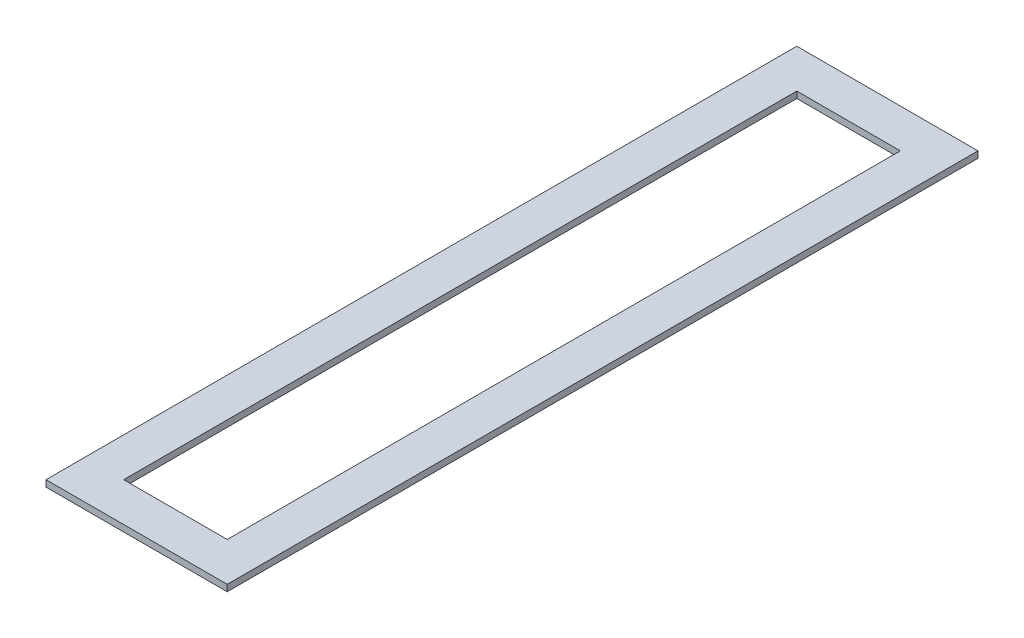
ISO-10303-21;
HEADER;
FILE_DESCRIPTION(('STEP AP214'),'2;1');
FILE_NAME('part.step','',(''),(''),'','','');
FILE_SCHEMA(('AUTOMOTIVE_DESIGN { 1 0 10303 214 1 1 1 1 }'));
ENDSEC;
DATA;
#1=APPLICATION_CONTEXT('core data for automotive mechanical design processes');
#2=APPLICATION_PROTOCOL_DEFINITION('international standard','automotive_design',2000,#1);
#3=PRODUCT_CONTEXT('',#1,'mechanical');
#4=PRODUCT('Part','Part','',(#3));
#5=PRODUCT_RELATED_PRODUCT_CATEGORY('part','',(#4));
#6=PRODUCT_DEFINITION_FORMATION('','',#4);
#7=PRODUCT_DEFINITION_CONTEXT('part definition',#1,'design');
#8=PRODUCT_DEFINITION('design','',#6,#7);
#9=PRODUCT_DEFINITION_SHAPE('','',#8);
#10=(LENGTH_UNIT() NAMED_UNIT(*) SI_UNIT(.MILLI.,.METRE.));
#11=(NAMED_UNIT(*) PLANE_ANGLE_UNIT() SI_UNIT($,.RADIAN.));
#12=(NAMED_UNIT(*) SI_UNIT($,.STERADIAN.) SOLID_ANGLE_UNIT());
#13=UNCERTAINTY_MEASURE_WITH_UNIT(LENGTH_MEASURE(1.E-05),#10,'distance_accuracy_value','');
#14=(GEOMETRIC_REPRESENTATION_CONTEXT(3) GLOBAL_UNCERTAINTY_ASSIGNED_CONTEXT((#13)) GLOBAL_UNIT_ASSIGNED_CONTEXT((#10,
#11,#12)) REPRESENTATION_CONTEXT('',''));
#15=CARTESIAN_POINT('',(0.,0.,0.));
#16=DIRECTION('',(0.,0.,1.));
#17=DIRECTION('',(1.,0.,0.));
#18=AXIS2_PLACEMENT_3D('',#15,#16,#17);
#19=CARTESIAN_POINT('',(0.,1.,-52.));
#20=DIRECTION('',(0.,0.,-1.));
#21=DIRECTION('',(-1.,0.,0.));
#22=AXIS2_PLACEMENT_3D('',#19,#20,#21);
#23=PLANE('',#22);
#24=DIRECTION('',(1.,0.,0.));
#25=VECTOR('',#24,1.);
#26=CARTESIAN_POINT('',(0.,0.,-52.));
#27=LINE('',#26,#25);
#28=CARTESIAN_POINT('',(-8.00000000000001,0.,-52.));
#29=VERTEX_POINT('',#28);
#30=CARTESIAN_POINT('',(7.99999999999999,0.,-52.));
#31=VERTEX_POINT('',#30);
#32=EDGE_CURVE('E161',#29,#31,#27,.T.);
#33=ORIENTED_EDGE('',*,*,#32,.T.);
#34=DIRECTION('',(0.,-1.,0.));
#35=VECTOR('',#34,1.);
#36=CARTESIAN_POINT('',(7.99999999999999,1.,-52.));
#37=LINE('',#36,#35);
#38=CARTESIAN_POINT('',(7.99999999999999,1.,-52.));
#39=VERTEX_POINT('',#38);
#40=EDGE_CURVE('E11',#39,#31,#37,.T.);
#41=ORIENTED_EDGE('',*,*,#40,.F.);
#42=DIRECTION('',(1.,0.,0.));
#43=VECTOR('',#42,1.);
#44=CARTESIAN_POINT('',(0.,1.,-52.));
#45=LINE('',#44,#43);
#46=CARTESIAN_POINT('',(-8.00000000000001,1.,-52.));
#47=VERTEX_POINT('',#46);
#48=EDGE_CURVE('E125',#47,#39,#45,.T.);
#49=ORIENTED_EDGE('',*,*,#48,.F.);
#50=DIRECTION('',(0.,-1.,0.));
#51=VECTOR('',#50,1.);
#52=CARTESIAN_POINT('',(-8.00000000000001,1.,-52.));
#53=LINE('',#52,#51);
#54=EDGE_CURVE('E65',#47,#29,#53,.T.);
#55=ORIENTED_EDGE('',*,*,#54,.T.);
#56=EDGE_LOOP('',(#33,#41,#49,#55));
#57=FACE_BOUND('',#56,.T.);
#58=ADVANCED_FACE('F45',(#57),#23,.F.);
#59=CARTESIAN_POINT('',(8.,1.,0.));
#60=DIRECTION('',(1.,0.,0.));
#61=DIRECTION('',(0.,0.,-1.));
#62=AXIS2_PLACEMENT_3D('',#59,#60,#61);
#63=PLANE('',#62);
#64=DIRECTION('',(0.,0.,1.));
#65=VECTOR('',#64,1.);
#66=CARTESIAN_POINT('',(8.,0.,0.));
#67=LINE('',#66,#65);
#68=CARTESIAN_POINT('',(8.,0.,52.));
#69=VERTEX_POINT('',#68);
#70=EDGE_CURVE('E132',#31,#69,#67,.T.);
#71=ORIENTED_EDGE('',*,*,#70,.T.);
#72=DIRECTION('',(0.,-1.,0.));
#73=VECTOR('',#72,1.);
#74=CARTESIAN_POINT('',(8.,1.,52.));
#75=LINE('',#74,#73);
#76=CARTESIAN_POINT('',(8.,1.,52.));
#77=VERTEX_POINT('',#76);
#78=EDGE_CURVE('E56',#77,#69,#75,.T.);
#79=ORIENTED_EDGE('',*,*,#78,.F.);
#80=DIRECTION('',(0.,0.,1.));
#81=VECTOR('',#80,1.);
#82=CARTESIAN_POINT('',(8.,1.,0.));
#83=LINE('',#82,#81);
#84=EDGE_CURVE('E119',#39,#77,#83,.T.);
#85=ORIENTED_EDGE('',*,*,#84,.F.);
#86=ORIENTED_EDGE('',*,*,#40,.T.);
#87=EDGE_LOOP('',(#71,#79,#85,#86));
#88=FACE_BOUND('',#87,.T.);
#89=ADVANCED_FACE('F131',(#88),#63,.F.);
#90=CARTESIAN_POINT('',(0.,1.,52.));
#91=DIRECTION('',(0.,0.,-1.));
#92=DIRECTION('',(-1.,0.,0.));
#93=AXIS2_PLACEMENT_3D('',#90,#91,#92);
#94=PLANE('',#93);
#95=DIRECTION('',(1.,0.,0.));
#96=VECTOR('',#95,1.);
#97=CARTESIAN_POINT('',(0.,0.,52.));
#98=LINE('',#97,#96);
#99=CARTESIAN_POINT('',(-7.99999999999999,0.,52.));
#100=VERTEX_POINT('',#99);
#101=EDGE_CURVE('E166',#100,#69,#98,.T.);
#102=ORIENTED_EDGE('',*,*,#101,.F.);
#103=DIRECTION('',(0.,-1.,0.));
#104=VECTOR('',#103,1.);
#105=CARTESIAN_POINT('',(-7.99999999999999,1.,52.));
#106=LINE('',#105,#104);
#107=CARTESIAN_POINT('',(-7.99999999999999,1.,52.));
#108=VERTEX_POINT('',#107);
#109=EDGE_CURVE('E91',#108,#100,#106,.T.);
#110=ORIENTED_EDGE('',*,*,#109,.F.);
#111=DIRECTION('',(1.,0.,0.));
#112=VECTOR('',#111,1.);
#113=CARTESIAN_POINT('',(0.,1.,52.));
#114=LINE('',#113,#112);
#115=EDGE_CURVE('E124',#108,#77,#114,.T.);
#116=ORIENTED_EDGE('',*,*,#115,.T.);
#117=ORIENTED_EDGE('',*,*,#78,.T.);
#118=EDGE_LOOP('',(#102,#110,#116,#117));
#119=FACE_BOUND('',#118,.T.);
#120=ADVANCED_FACE('F137',(#119),#94,.T.);
#121=CARTESIAN_POINT('',(0.,1.,-58.));
#122=DIRECTION('',(0.,0.,-1.));
#123=DIRECTION('',(-1.,0.,0.));
#124=AXIS2_PLACEMENT_3D('',#121,#122,#123);
#125=PLANE('',#124);
#126=DIRECTION('',(1.,0.,0.));
#127=VECTOR('',#126,1.);
#128=CARTESIAN_POINT('',(0.,0.,-58.));
#129=LINE('',#128,#127);
#130=CARTESIAN_POINT('',(-14.,0.,-58.));
#131=VERTEX_POINT('',#130);
#132=CARTESIAN_POINT('',(14.,0.,-58.));
#133=VERTEX_POINT('',#132);
#134=EDGE_CURVE('E146',#131,#133,#129,.T.);
#135=ORIENTED_EDGE('',*,*,#134,.F.);
#136=DIRECTION('',(0.,-1.,0.));
#137=VECTOR('',#136,1.);
#138=CARTESIAN_POINT('',(-14.,1.,-58.));
#139=LINE('',#138,#137);
#140=CARTESIAN_POINT('',(-14.,1.,-58.));
#141=VERTEX_POINT('',#140);
#142=EDGE_CURVE('E49',#141,#131,#139,.T.);
#143=ORIENTED_EDGE('',*,*,#142,.F.);
#144=DIRECTION('',(1.,0.,0.));
#145=VECTOR('',#144,1.);
#146=CARTESIAN_POINT('',(0.,1.,-58.));
#147=LINE('',#146,#145);
#148=CARTESIAN_POINT('',(14.,1.,-58.));
#149=VERTEX_POINT('',#148);
#150=EDGE_CURVE('E173',#141,#149,#147,.T.);
#151=ORIENTED_EDGE('',*,*,#150,.T.);
#152=DIRECTION('',(0.,-1.,0.));
#153=VECTOR('',#152,1.);
#154=CARTESIAN_POINT('',(14.,1.,-58.));
#155=LINE('',#154,#153);
#156=EDGE_CURVE('E142',#149,#133,#155,.T.);
#157=ORIENTED_EDGE('',*,*,#156,.T.);
#158=EDGE_LOOP('',(#135,#143,#151,#157));
#159=FACE_BOUND('',#158,.T.);
#160=ADVANCED_FACE('F47',(#159),#125,.T.);
#161=CARTESIAN_POINT('',(-14.,1.,0.));
#162=DIRECTION('',(1.,0.,0.));
#163=DIRECTION('',(0.,0.,-1.));
#164=AXIS2_PLACEMENT_3D('',#161,#162,#163);
#165=PLANE('',#164);
#166=DIRECTION('',(0.,0.,1.));
#167=VECTOR('',#166,1.);
#168=CARTESIAN_POINT('',(-14.,0.,0.));
#169=LINE('',#168,#167);
#170=CARTESIAN_POINT('',(-14.,0.,58.));
#171=VERTEX_POINT('',#170);
#172=EDGE_CURVE('E150',#131,#171,#169,.T.);
#173=ORIENTED_EDGE('',*,*,#172,.T.);
#174=DIRECTION('',(0.,-1.,0.));
#175=VECTOR('',#174,1.);
#176=CARTESIAN_POINT('',(-14.,1.,58.));
#177=LINE('',#176,#175);
#178=CARTESIAN_POINT('',(-14.,1.,58.));
#179=VERTEX_POINT('',#178);
#180=EDGE_CURVE('E182',#179,#171,#177,.T.);
#181=ORIENTED_EDGE('',*,*,#180,.F.);
#182=DIRECTION('',(0.,0.,1.));
#183=VECTOR('',#182,1.);
#184=CARTESIAN_POINT('',(-14.,1.,0.));
#185=LINE('',#184,#183);
#186=EDGE_CURVE('E193',#141,#179,#185,.T.);
#187=ORIENTED_EDGE('',*,*,#186,.F.);
#188=ORIENTED_EDGE('',*,*,#142,.T.);
#189=EDGE_LOOP('',(#173,#181,#187,#188));
#190=FACE_BOUND('',#189,.T.);
#191=ADVANCED_FACE('F192',(#190),#165,.F.);
#192=CARTESIAN_POINT('',(0.,1.,58.));
#193=DIRECTION('',(0.,0.,-1.));
#194=DIRECTION('',(-1.,0.,0.));
#195=AXIS2_PLACEMENT_3D('',#192,#193,#194);
#196=PLANE('',#195);
#197=DIRECTION('',(1.,0.,0.));
#198=VECTOR('',#197,1.);
#199=CARTESIAN_POINT('',(0.,0.,58.));
#200=LINE('',#199,#198);
#201=CARTESIAN_POINT('',(14.,0.,58.));
#202=VERTEX_POINT('',#201);
#203=EDGE_CURVE('E153',#171,#202,#200,.T.);
#204=ORIENTED_EDGE('',*,*,#203,.T.);
#205=DIRECTION('',(0.,-1.,0.));
#206=VECTOR('',#205,1.);
#207=CARTESIAN_POINT('',(14.,1.,58.));
#208=LINE('',#207,#206);
#209=CARTESIAN_POINT('',(14.,1.,58.));
#210=VERTEX_POINT('',#209);
#211=EDGE_CURVE('E180',#210,#202,#208,.T.);
#212=ORIENTED_EDGE('',*,*,#211,.F.);
#213=DIRECTION('',(1.,0.,0.));
#214=VECTOR('',#213,1.);
#215=CARTESIAN_POINT('',(0.,1.,58.));
#216=LINE('',#215,#214);
#217=EDGE_CURVE('E234',#179,#210,#216,.T.);
#218=ORIENTED_EDGE('',*,*,#217,.F.);
#219=ORIENTED_EDGE('',*,*,#180,.T.);
#220=EDGE_LOOP('',(#204,#212,#218,#219));
#221=FACE_BOUND('',#220,.T.);
#222=ADVANCED_FACE('F205',(#221),#196,.F.);
#223=CARTESIAN_POINT('',(14.,1.,0.));
#224=DIRECTION('',(1.,0.,0.));
#225=DIRECTION('',(0.,0.,-1.));
#226=AXIS2_PLACEMENT_3D('',#223,#224,#225);
#227=PLANE('',#226);
#228=DIRECTION('',(0.,0.,1.));
#229=VECTOR('',#228,1.);
#230=CARTESIAN_POINT('',(14.,0.,0.));
#231=LINE('',#230,#229);
#232=EDGE_CURVE('E157',#133,#202,#231,.T.);
#233=ORIENTED_EDGE('',*,*,#232,.F.);
#234=ORIENTED_EDGE('',*,*,#156,.F.);
#235=DIRECTION('',(0.,0.,1.));
#236=VECTOR('',#235,1.);
#237=CARTESIAN_POINT('',(14.,1.,0.));
#238=LINE('',#237,#236);
#239=EDGE_CURVE('E203',#149,#210,#238,.T.);
#240=ORIENTED_EDGE('',*,*,#239,.T.);
#241=ORIENTED_EDGE('',*,*,#211,.T.);
#242=EDGE_LOOP('',(#233,#234,#240,#241));
#243=FACE_BOUND('',#242,.T.);
#244=ADVANCED_FACE('F202',(#243),#227,.T.);
#245=CARTESIAN_POINT('',(-8.,1.,0.));
#246=DIRECTION('',(1.,0.,0.));
#247=DIRECTION('',(0.,0.,-1.));
#248=AXIS2_PLACEMENT_3D('',#245,#246,#247);
#249=PLANE('',#248);
#250=DIRECTION('',(0.,0.,1.));
#251=VECTOR('',#250,1.);
#252=CARTESIAN_POINT('',(-8.,0.,0.));
#253=LINE('',#252,#251);
#254=EDGE_CURVE('E169',#29,#100,#253,.T.);
#255=ORIENTED_EDGE('',*,*,#254,.F.);
#256=ORIENTED_EDGE('',*,*,#54,.F.);
#257=DIRECTION('',(0.,0.,1.));
#258=VECTOR('',#257,1.);
#259=CARTESIAN_POINT('',(-8.,1.,0.));
#260=LINE('',#259,#258);
#261=EDGE_CURVE('E139',#47,#108,#260,.T.);
#262=ORIENTED_EDGE('',*,*,#261,.T.);
#263=ORIENTED_EDGE('',*,*,#109,.T.);
#264=EDGE_LOOP('',(#255,#256,#262,#263));
#265=FACE_BOUND('',#264,.T.);
#266=ADVANCED_FACE('F212',(#265),#249,.T.);
#267=CARTESIAN_POINT('',(0.,1.,0.));
#268=DIRECTION('',(0.,1.,0.));
#269=DIRECTION('',(0.,0.,1.));
#270=AXIS2_PLACEMENT_3D('',#267,#268,#269);
#271=PLANE('',#270);
#272=ORIENTED_EDGE('',*,*,#150,.F.);
#273=ORIENTED_EDGE('',*,*,#186,.T.);
#274=ORIENTED_EDGE('',*,*,#217,.T.);
#275=ORIENTED_EDGE('',*,*,#239,.F.);
#276=EDGE_LOOP('',(#272,#273,#274,#275));
#277=FACE_BOUND('',#276,.T.);
#278=ORIENTED_EDGE('',*,*,#48,.T.);
#279=ORIENTED_EDGE('',*,*,#84,.T.);
#280=ORIENTED_EDGE('',*,*,#115,.F.);
#281=ORIENTED_EDGE('',*,*,#261,.F.);
#282=EDGE_LOOP('',(#278,#279,#280,#281));
#283=FACE_BOUND('',#282,.T.);
#284=ADVANCED_FACE('F121',(#277,#283),#271,.T.);
#285=CARTESIAN_POINT('',(0.,0.,0.));
#286=DIRECTION('',(0.,1.,0.));
#287=DIRECTION('',(0.,0.,1.));
#288=AXIS2_PLACEMENT_3D('',#285,#286,#287);
#289=PLANE('',#288);
#290=ORIENTED_EDGE('',*,*,#134,.T.);
#291=ORIENTED_EDGE('',*,*,#232,.T.);
#292=ORIENTED_EDGE('',*,*,#203,.F.);
#293=ORIENTED_EDGE('',*,*,#172,.F.);
#294=EDGE_LOOP('',(#290,#291,#292,#293));
#295=FACE_BOUND('',#294,.T.);
#296=ORIENTED_EDGE('',*,*,#32,.F.);
#297=ORIENTED_EDGE('',*,*,#254,.T.);
#298=ORIENTED_EDGE('',*,*,#101,.T.);
#299=ORIENTED_EDGE('',*,*,#70,.F.);
#300=EDGE_LOOP('',(#296,#297,#298,#299));
#301=FACE_BOUND('',#300,.T.);
#302=ADVANCED_FACE('F196',(#295,#301),#289,.F.);
#303=CLOSED_SHELL('',(#58,#89,#120,#160,#191,#222,#244,#266,#284,#302));
#304=MANIFOLD_SOLID_BREP('B2',#303);
#305=ADVANCED_BREP_SHAPE_REPRESENTATION('',(#18,#304),#14);
#306=SHAPE_DEFINITION_REPRESENTATION(#9,#305);
ENDSEC;
END-ISO-10303-21;
